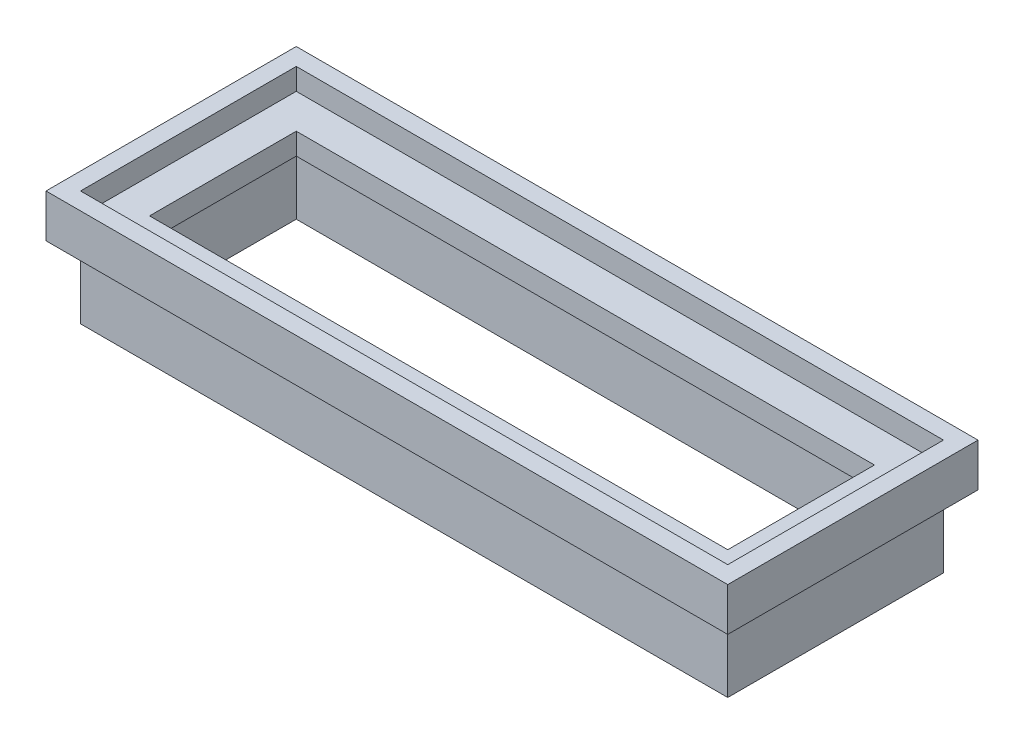
ISO-10303-21;
HEADER;
FILE_DESCRIPTION(('STEP AP214'),'2;1');
FILE_NAME('part.step','',(''),(''),'','','');
FILE_SCHEMA(('AUTOMOTIVE_DESIGN { 1 0 10303 214 1 1 1 1 }'));
ENDSEC;
DATA;
#1=APPLICATION_CONTEXT('core data for automotive mechanical design processes');
#2=APPLICATION_PROTOCOL_DEFINITION('international standard','automotive_design',2000,#1);
#3=PRODUCT_CONTEXT('',#1,'mechanical');
#4=PRODUCT('Part','Part','',(#3));
#5=PRODUCT_RELATED_PRODUCT_CATEGORY('part','',(#4));
#6=PRODUCT_DEFINITION_FORMATION('','',#4);
#7=PRODUCT_DEFINITION_CONTEXT('part definition',#1,'design');
#8=PRODUCT_DEFINITION('design','',#6,#7);
#9=PRODUCT_DEFINITION_SHAPE('','',#8);
#10=(LENGTH_UNIT() NAMED_UNIT(*) SI_UNIT(.MILLI.,.METRE.));
#11=(NAMED_UNIT(*) PLANE_ANGLE_UNIT() SI_UNIT($,.RADIAN.));
#12=(NAMED_UNIT(*) SI_UNIT($,.STERADIAN.) SOLID_ANGLE_UNIT());
#13=UNCERTAINTY_MEASURE_WITH_UNIT(LENGTH_MEASURE(1.E-05),#10,'distance_accuracy_value','');
#14=(GEOMETRIC_REPRESENTATION_CONTEXT(3) GLOBAL_UNCERTAINTY_ASSIGNED_CONTEXT((#13)) GLOBAL_UNIT_ASSIGNED_CONTEXT((#10,
#11,#12)) REPRESENTATION_CONTEXT('',''));
#15=CARTESIAN_POINT('',(0.,0.,0.));
#16=DIRECTION('',(0.,0.,1.));
#17=DIRECTION('',(1.,0.,0.));
#18=AXIS2_PLACEMENT_3D('',#15,#16,#17);
#19=CARTESIAN_POINT('',(0.,8.,0.));
#20=DIRECTION('',(0.,1.,0.));
#21=DIRECTION('',(0.,0.,1.));
#22=AXIS2_PLACEMENT_3D('',#19,#20,#21);
#23=PLANE('',#22);
#24=DIRECTION('',(0.,0.,1.));
#25=VECTOR('',#24,1.);
#26=CARTESIAN_POINT('',(-29.2763157894737,8.,-7.74736842105263));
#27=LINE('',#26,#25);
#28=CARTESIAN_POINT('',(-29.2763157894737,8.,-11.3473684210526));
#29=VERTEX_POINT('',#28);
#30=CARTESIAN_POINT('',(-29.2763157894737,8.,6.05263157894737));
#31=VERTEX_POINT('',#30);
#32=EDGE_CURVE('E271',#29,#31,#27,.T.);
#33=ORIENTED_EDGE('',*,*,#32,.T.);
#34=DIRECTION('',(1.,0.,0.));
#35=VECTOR('',#34,1.);
#36=CARTESIAN_POINT('',(-25.6763157894737,8.,6.05263157894737));
#37=LINE('',#36,#35);
#38=CARTESIAN_POINT('',(18.1236842105263,8.,6.05263157894737));
#39=VERTEX_POINT('',#38);
#40=EDGE_CURVE('E274',#31,#39,#37,.T.);
#41=ORIENTED_EDGE('',*,*,#40,.T.);
#42=DIRECTION('',(0.,0.,1.));
#43=VECTOR('',#42,1.);
#44=CARTESIAN_POINT('',(18.1236842105263,8.,-7.74736842105263));
#45=LINE('',#44,#43);
#46=CARTESIAN_POINT('',(18.1236842105263,8.,-11.3473684210526));
#47=VERTEX_POINT('',#46);
#48=EDGE_CURVE('E277',#47,#39,#45,.T.);
#49=ORIENTED_EDGE('',*,*,#48,.F.);
#50=DIRECTION('',(1.,0.,0.));
#51=VECTOR('',#50,1.);
#52=CARTESIAN_POINT('',(-25.6763157894737,8.,-11.3473684210526));
#53=LINE('',#52,#51);
#54=EDGE_CURVE('E280',#29,#47,#53,.T.);
#55=ORIENTED_EDGE('',*,*,#54,.F.);
#56=EDGE_LOOP('',(#33,#41,#49,#55));
#57=FACE_BOUND('',#56,.T.);
#58=DIRECTION('',(0.,0.,1.));
#59=VECTOR('',#58,1.);
#60=CARTESIAN_POINT('',(-28.0763157894737,8.,-10.1473684210526));
#61=LINE('',#60,#59);
#62=CARTESIAN_POINT('',(-28.0763157894737,8.,-10.1473684210526));
#63=VERTEX_POINT('',#62);
#64=CARTESIAN_POINT('',(-28.0763157894737,8.,4.85263157894737));
#65=VERTEX_POINT('',#64);
#66=EDGE_CURVE('E233',#63,#65,#61,.T.);
#67=ORIENTED_EDGE('',*,*,#66,.F.);
#68=DIRECTION('',(1.,0.,0.));
#69=VECTOR('',#68,1.);
#70=CARTESIAN_POINT('',(-28.0763157894737,8.,-10.1473684210526));
#71=LINE('',#70,#69);
#72=CARTESIAN_POINT('',(16.9236842105263,8.,-10.1473684210526));
#73=VERTEX_POINT('',#72);
#74=EDGE_CURVE('E96',#63,#73,#71,.T.);
#75=ORIENTED_EDGE('',*,*,#74,.T.);
#76=DIRECTION('',(0.,0.,1.));
#77=VECTOR('',#76,1.);
#78=CARTESIAN_POINT('',(16.9236842105263,8.,-10.1473684210526));
#79=LINE('',#78,#77);
#80=CARTESIAN_POINT('',(16.9236842105263,8.,4.85263157894737));
#81=VERTEX_POINT('',#80);
#82=EDGE_CURVE('E237',#73,#81,#79,.T.);
#83=ORIENTED_EDGE('',*,*,#82,.T.);
#84=DIRECTION('',(1.,0.,0.));
#85=VECTOR('',#84,1.);
#86=CARTESIAN_POINT('',(-28.0763157894737,8.,4.85263157894737));
#87=LINE('',#86,#85);
#88=EDGE_CURVE('E642',#65,#81,#87,.T.);
#89=ORIENTED_EDGE('',*,*,#88,.F.);
#90=EDGE_LOOP('',(#67,#75,#83,#89));
#91=FACE_BOUND('',#90,.T.);
#92=ADVANCED_FACE('F81',(#57,#91),#23,.T.);
#93=CARTESIAN_POINT('',(0.,0.,0.));
#94=DIRECTION('',(0.,1.,0.));
#95=DIRECTION('',(0.,0.,1.));
#96=AXIS2_PLACEMENT_3D('',#93,#94,#95);
#97=PLANE('',#96);
#98=DIRECTION('',(0.,0.,1.));
#99=VECTOR('',#98,1.);
#100=CARTESIAN_POINT('',(-28.0763157894737,0.,-8.94736842105263));
#101=LINE('',#100,#99);
#102=CARTESIAN_POINT('',(-28.0763157894737,0.,-10.1473684210526));
#103=VERTEX_POINT('',#102);
#104=CARTESIAN_POINT('',(-28.0763157894737,0.,4.85263157894737));
#105=VERTEX_POINT('',#104);
#106=EDGE_CURVE('E335',#103,#105,#101,.T.);
#107=ORIENTED_EDGE('',*,*,#106,.F.);
#108=DIRECTION('',(1.,0.,0.));
#109=VECTOR('',#108,1.);
#110=CARTESIAN_POINT('',(-26.8763157894737,0.,-10.1473684210526));
#111=LINE('',#110,#109);
#112=CARTESIAN_POINT('',(16.9236842105263,0.,-10.1473684210526));
#113=VERTEX_POINT('',#112);
#114=EDGE_CURVE('E339',#103,#113,#111,.T.);
#115=ORIENTED_EDGE('',*,*,#114,.T.);
#116=DIRECTION('',(0.,0.,1.));
#117=VECTOR('',#116,1.);
#118=CARTESIAN_POINT('',(16.9236842105263,0.,-8.94736842105263));
#119=LINE('',#118,#117);
#120=CARTESIAN_POINT('',(16.9236842105263,0.,4.85263157894737));
#121=VERTEX_POINT('',#120);
#122=EDGE_CURVE('E353',#113,#121,#119,.T.);
#123=ORIENTED_EDGE('',*,*,#122,.T.);
#124=DIRECTION('',(1.,0.,0.));
#125=VECTOR('',#124,1.);
#126=CARTESIAN_POINT('',(-26.8763157894737,0.,4.85263157894737));
#127=LINE('',#126,#125);
#128=EDGE_CURVE('E350',#105,#121,#127,.T.);
#129=ORIENTED_EDGE('',*,*,#128,.F.);
#130=EDGE_LOOP('',(#107,#115,#123,#129));
#131=FACE_BOUND('',#130,.T.);
#132=DIRECTION('',(0.,0.,1.));
#133=VECTOR('',#132,1.);
#134=CARTESIAN_POINT('',(-26.8763157894737,0.,-8.94736842105263));
#135=LINE('',#134,#133);
#136=CARTESIAN_POINT('',(-26.8763157894737,0.,-8.94736842105263));
#137=VERTEX_POINT('',#136);
#138=CARTESIAN_POINT('',(-26.8763157894737,0.,3.65263157894737));
#139=VERTEX_POINT('',#138);
#140=EDGE_CURVE('E302',#137,#139,#135,.T.);
#141=ORIENTED_EDGE('',*,*,#140,.T.);
#142=DIRECTION('',(1.,0.,0.));
#143=VECTOR('',#142,1.);
#144=CARTESIAN_POINT('',(-26.8763157894737,0.,3.65263157894737));
#145=LINE('',#144,#143);
#146=CARTESIAN_POINT('',(15.7236842105263,0.,3.65263157894737));
#147=VERTEX_POINT('',#146);
#148=EDGE_CURVE('E318',#139,#147,#145,.T.);
#149=ORIENTED_EDGE('',*,*,#148,.T.);
#150=DIRECTION('',(0.,0.,1.));
#151=VECTOR('',#150,1.);
#152=CARTESIAN_POINT('',(15.7236842105263,0.,-8.94736842105263));
#153=LINE('',#152,#151);
#154=CARTESIAN_POINT('',(15.7236842105263,0.,-8.94736842105263));
#155=VERTEX_POINT('',#154);
#156=EDGE_CURVE('E321',#155,#147,#153,.T.);
#157=ORIENTED_EDGE('',*,*,#156,.F.);
#158=DIRECTION('',(1.,0.,0.));
#159=VECTOR('',#158,1.);
#160=CARTESIAN_POINT('',(-26.8763157894737,0.,-8.94736842105263));
#161=LINE('',#160,#159);
#162=EDGE_CURVE('E306',#137,#155,#161,.T.);
#163=ORIENTED_EDGE('',*,*,#162,.F.);
#164=EDGE_LOOP('',(#141,#149,#157,#163));
#165=FACE_BOUND('',#164,.T.);
#166=ADVANCED_FACE('F374',(#131,#165),#97,.F.);
#167=CARTESIAN_POINT('',(-28.0763157894737,5.,-8.94736842105263));
#168=DIRECTION('',(1.,0.,0.));
#169=DIRECTION('',(0.,0.,-1.));
#170=AXIS2_PLACEMENT_3D('',#167,#168,#169);
#171=PLANE('',#170);
#172=ORIENTED_EDGE('',*,*,#106,.T.);
#173=DIRECTION('',(0.,-1.,0.));
#174=VECTOR('',#173,1.);
#175=CARTESIAN_POINT('',(-28.0763157894737,5.,4.85263157894737));
#176=LINE('',#175,#174);
#177=CARTESIAN_POINT('',(-28.0763157894737,5.,4.85263157894737));
#178=VERTEX_POINT('',#177);
#179=EDGE_CURVE('E89',#178,#105,#176,.T.);
#180=ORIENTED_EDGE('',*,*,#179,.F.);
#181=DIRECTION('',(0.,0.,1.));
#182=VECTOR('',#181,1.);
#183=CARTESIAN_POINT('',(-28.0763157894737,5.,-8.94736842105263));
#184=LINE('',#183,#182);
#185=CARTESIAN_POINT('',(-28.0763157894737,5.,-10.1473684210526));
#186=VERTEX_POINT('',#185);
#187=EDGE_CURVE('E336',#186,#178,#184,.T.);
#188=ORIENTED_EDGE('',*,*,#187,.F.);
#189=DIRECTION('',(0.,-1.,0.));
#190=VECTOR('',#189,1.);
#191=CARTESIAN_POINT('',(-28.0763157894737,5.,-10.1473684210526));
#192=LINE('',#191,#190);
#193=EDGE_CURVE('E347',#186,#103,#192,.T.);
#194=ORIENTED_EDGE('',*,*,#193,.T.);
#195=EDGE_LOOP('',(#172,#180,#188,#194));
#196=FACE_BOUND('',#195,.T.);
#197=ADVANCED_FACE('F83',(#196),#171,.F.);
#198=CARTESIAN_POINT('',(-26.8763157894737,5.,4.85263157894737));
#199=DIRECTION('',(0.,0.,-1.));
#200=DIRECTION('',(-1.,0.,0.));
#201=AXIS2_PLACEMENT_3D('',#198,#199,#200);
#202=PLANE('',#201);
#203=ORIENTED_EDGE('',*,*,#128,.T.);
#204=DIRECTION('',(0.,-1.,0.));
#205=VECTOR('',#204,1.);
#206=CARTESIAN_POINT('',(16.9236842105263,5.,4.85263157894737));
#207=LINE('',#206,#205);
#208=CARTESIAN_POINT('',(16.9236842105263,5.,4.85263157894737));
#209=VERTEX_POINT('',#208);
#210=EDGE_CURVE('E361',#209,#121,#207,.T.);
#211=ORIENTED_EDGE('',*,*,#210,.F.);
#212=DIRECTION('',(1.,0.,0.));
#213=VECTOR('',#212,1.);
#214=CARTESIAN_POINT('',(-26.8763157894737,5.,4.85263157894737));
#215=LINE('',#214,#213);
#216=EDGE_CURVE('E338',#178,#209,#215,.T.);
#217=ORIENTED_EDGE('',*,*,#216,.F.);
#218=ORIENTED_EDGE('',*,*,#179,.T.);
#219=EDGE_LOOP('',(#203,#211,#217,#218));
#220=FACE_BOUND('',#219,.T.);
#221=ADVANCED_FACE('F366',(#220),#202,.F.);
#222=CARTESIAN_POINT('',(16.9236842105263,5.,-8.94736842105263));
#223=DIRECTION('',(1.,0.,0.));
#224=DIRECTION('',(0.,0.,-1.));
#225=AXIS2_PLACEMENT_3D('',#222,#223,#224);
#226=PLANE('',#225);
#227=ORIENTED_EDGE('',*,*,#122,.F.);
#228=DIRECTION('',(0.,-1.,0.));
#229=VECTOR('',#228,1.);
#230=CARTESIAN_POINT('',(16.9236842105263,5.,-10.1473684210526));
#231=LINE('',#230,#229);
#232=CARTESIAN_POINT('',(16.9236842105263,5.,-10.1473684210526));
#233=VERTEX_POINT('',#232);
#234=EDGE_CURVE('E359',#233,#113,#231,.T.);
#235=ORIENTED_EDGE('',*,*,#234,.F.);
#236=DIRECTION('',(0.,0.,1.));
#237=VECTOR('',#236,1.);
#238=CARTESIAN_POINT('',(16.9236842105263,5.,-8.94736842105263));
#239=LINE('',#238,#237);
#240=EDGE_CURVE('E341',#233,#209,#239,.T.);
#241=ORIENTED_EDGE('',*,*,#240,.T.);
#242=ORIENTED_EDGE('',*,*,#210,.T.);
#243=EDGE_LOOP('',(#227,#235,#241,#242));
#244=FACE_BOUND('',#243,.T.);
#245=ADVANCED_FACE('F381',(#244),#226,.T.);
#246=CARTESIAN_POINT('',(-26.8763157894737,5.,-10.1473684210526));
#247=DIRECTION('',(0.,0.,-1.));
#248=DIRECTION('',(-1.,0.,0.));
#249=AXIS2_PLACEMENT_3D('',#246,#247,#248);
#250=PLANE('',#249);
#251=ORIENTED_EDGE('',*,*,#114,.F.);
#252=ORIENTED_EDGE('',*,*,#193,.F.);
#253=DIRECTION('',(1.,0.,0.));
#254=VECTOR('',#253,1.);
#255=CARTESIAN_POINT('',(-26.8763157894737,5.,-10.1473684210526));
#256=LINE('',#255,#254);
#257=EDGE_CURVE('E344',#186,#233,#256,.T.);
#258=ORIENTED_EDGE('',*,*,#257,.T.);
#259=ORIENTED_EDGE('',*,*,#234,.T.);
#260=EDGE_LOOP('',(#251,#252,#258,#259));
#261=FACE_BOUND('',#260,.T.);
#262=ADVANCED_FACE('F377',(#261),#250,.T.);
#263=CARTESIAN_POINT('',(-26.8763157894737,5.,-8.94736842105263));
#264=DIRECTION('',(1.,0.,0.));
#265=DIRECTION('',(0.,0.,-1.));
#266=AXIS2_PLACEMENT_3D('',#263,#264,#265);
#267=PLANE('',#266);
#268=ORIENTED_EDGE('',*,*,#140,.F.);
#269=DIRECTION('',(0.,-1.,0.));
#270=VECTOR('',#269,1.);
#271=CARTESIAN_POINT('',(-26.8763157894737,5.,-8.94736842105263));
#272=LINE('',#271,#270);
#273=CARTESIAN_POINT('',(-26.8763157894737,5.,-8.94736842105263));
#274=VERTEX_POINT('',#273);
#275=EDGE_CURVE('E315',#274,#137,#272,.T.);
#276=ORIENTED_EDGE('',*,*,#275,.F.);
#277=DIRECTION('',(0.,0.,1.));
#278=VECTOR('',#277,1.);
#279=CARTESIAN_POINT('',(-26.8763157894737,5.,-8.94736842105263));
#280=LINE('',#279,#278);
#281=CARTESIAN_POINT('',(-26.8763157894737,5.,3.65263157894737));
#282=VERTEX_POINT('',#281);
#283=EDGE_CURVE('E303',#274,#282,#280,.T.);
#284=ORIENTED_EDGE('',*,*,#283,.T.);
#285=DIRECTION('',(0.,-1.,0.));
#286=VECTOR('',#285,1.);
#287=CARTESIAN_POINT('',(-26.8763157894737,5.,3.65263157894737));
#288=LINE('',#287,#286);
#289=EDGE_CURVE('E332',#282,#139,#288,.T.);
#290=ORIENTED_EDGE('',*,*,#289,.T.);
#291=EDGE_LOOP('',(#268,#276,#284,#290));
#292=FACE_BOUND('',#291,.T.);
#293=ADVANCED_FACE('F535',(#292),#267,.T.);
#294=CARTESIAN_POINT('',(-26.8763157894737,5.,3.65263157894737));
#295=DIRECTION('',(0.,0.,-1.));
#296=DIRECTION('',(-1.,0.,0.));
#297=AXIS2_PLACEMENT_3D('',#294,#295,#296);
#298=PLANE('',#297);
#299=ORIENTED_EDGE('',*,*,#148,.F.);
#300=ORIENTED_EDGE('',*,*,#289,.F.);
#301=DIRECTION('',(1.,0.,0.));
#302=VECTOR('',#301,1.);
#303=CARTESIAN_POINT('',(-26.8763157894737,5.,3.65263157894737));
#304=LINE('',#303,#302);
#305=CARTESIAN_POINT('',(15.7236842105263,5.,3.65263157894737));
#306=VERTEX_POINT('',#305);
#307=EDGE_CURVE('E305',#282,#306,#304,.T.);
#308=ORIENTED_EDGE('',*,*,#307,.T.);
#309=DIRECTION('',(0.,-1.,0.));
#310=VECTOR('',#309,1.);
#311=CARTESIAN_POINT('',(15.7236842105263,5.,3.65263157894737));
#312=LINE('',#311,#310);
#313=EDGE_CURVE('E330',#306,#147,#312,.T.);
#314=ORIENTED_EDGE('',*,*,#313,.T.);
#315=EDGE_LOOP('',(#299,#300,#308,#314));
#316=FACE_BOUND('',#315,.T.);
#317=ADVANCED_FACE('F525',(#316),#298,.T.);
#318=CARTESIAN_POINT('',(15.7236842105263,5.,-8.94736842105263));
#319=DIRECTION('',(1.,0.,0.));
#320=DIRECTION('',(0.,0.,-1.));
#321=AXIS2_PLACEMENT_3D('',#318,#319,#320);
#322=PLANE('',#321);
#323=ORIENTED_EDGE('',*,*,#156,.T.);
#324=ORIENTED_EDGE('',*,*,#313,.F.);
#325=DIRECTION('',(0.,0.,1.));
#326=VECTOR('',#325,1.);
#327=CARTESIAN_POINT('',(15.7236842105263,5.,-8.94736842105263));
#328=LINE('',#327,#326);
#329=CARTESIAN_POINT('',(15.7236842105263,5.,-8.94736842105263));
#330=VERTEX_POINT('',#329);
#331=EDGE_CURVE('E309',#330,#306,#328,.T.);
#332=ORIENTED_EDGE('',*,*,#331,.F.);
#333=DIRECTION('',(0.,-1.,0.));
#334=VECTOR('',#333,1.);
#335=CARTESIAN_POINT('',(15.7236842105263,5.,-8.94736842105263));
#336=LINE('',#335,#334);
#337=EDGE_CURVE('E328',#330,#155,#336,.T.);
#338=ORIENTED_EDGE('',*,*,#337,.T.);
#339=EDGE_LOOP('',(#323,#324,#332,#338));
#340=FACE_BOUND('',#339,.T.);
#341=ADVANCED_FACE('F395',(#340),#322,.F.);
#342=CARTESIAN_POINT('',(-26.8763157894737,5.,-8.94736842105263));
#343=DIRECTION('',(0.,0.,-1.));
#344=DIRECTION('',(-1.,0.,0.));
#345=AXIS2_PLACEMENT_3D('',#342,#343,#344);
#346=PLANE('',#345);
#347=ORIENTED_EDGE('',*,*,#162,.T.);
#348=ORIENTED_EDGE('',*,*,#337,.F.);
#349=DIRECTION('',(1.,0.,0.));
#350=VECTOR('',#349,1.);
#351=CARTESIAN_POINT('',(-26.8763157894737,5.,-8.94736842105263));
#352=LINE('',#351,#350);
#353=EDGE_CURVE('E312',#274,#330,#352,.T.);
#354=ORIENTED_EDGE('',*,*,#353,.F.);
#355=ORIENTED_EDGE('',*,*,#275,.T.);
#356=EDGE_LOOP('',(#347,#348,#354,#355));
#357=FACE_BOUND('',#356,.T.);
#358=ADVANCED_FACE('F386',(#357),#346,.F.);
#359=CARTESIAN_POINT('',(0.,5.,0.));
#360=DIRECTION('',(0.,1.,0.));
#361=DIRECTION('',(0.,0.,1.));
#362=AXIS2_PLACEMENT_3D('',#359,#360,#361);
#363=PLANE('',#362);
#364=DIRECTION('',(0.,0.,1.));
#365=VECTOR('',#364,1.);
#366=CARTESIAN_POINT('',(-29.2763157894737,5.,-7.74736842105263));
#367=LINE('',#366,#365);
#368=CARTESIAN_POINT('',(-29.2763157894737,5.,-11.3473684210526));
#369=VERTEX_POINT('',#368);
#370=CARTESIAN_POINT('',(-29.2763157894737,5.,6.05263157894737));
#371=VERTEX_POINT('',#370);
#372=EDGE_CURVE('E270',#369,#371,#367,.T.);
#373=ORIENTED_EDGE('',*,*,#372,.F.);
#374=DIRECTION('',(1.,0.,0.));
#375=VECTOR('',#374,1.);
#376=CARTESIAN_POINT('',(-25.6763157894737,5.,-11.3473684210526));
#377=LINE('',#376,#375);
#378=CARTESIAN_POINT('',(18.1236842105263,5.,-11.3473684210526));
#379=VERTEX_POINT('',#378);
#380=EDGE_CURVE('E275',#369,#379,#377,.T.);
#381=ORIENTED_EDGE('',*,*,#380,.T.);
#382=DIRECTION('',(0.,0.,1.));
#383=VECTOR('',#382,1.);
#384=CARTESIAN_POINT('',(18.1236842105263,5.,-7.74736842105263));
#385=LINE('',#384,#383);
#386=CARTESIAN_POINT('',(18.1236842105263,5.,6.05263157894737));
#387=VERTEX_POINT('',#386);
#388=EDGE_CURVE('E289',#379,#387,#385,.T.);
#389=ORIENTED_EDGE('',*,*,#388,.T.);
#390=DIRECTION('',(1.,0.,0.));
#391=VECTOR('',#390,1.);
#392=CARTESIAN_POINT('',(-25.6763157894737,5.,6.05263157894737));
#393=LINE('',#392,#391);
#394=EDGE_CURVE('E286',#371,#387,#393,.T.);
#395=ORIENTED_EDGE('',*,*,#394,.F.);
#396=EDGE_LOOP('',(#373,#381,#389,#395));
#397=FACE_BOUND('',#396,.T.);
#398=ORIENTED_EDGE('',*,*,#257,.F.);
#399=ORIENTED_EDGE('',*,*,#187,.T.);
#400=ORIENTED_EDGE('',*,*,#216,.T.);
#401=ORIENTED_EDGE('',*,*,#240,.F.);
#402=EDGE_LOOP('',(#398,#399,#400,#401));
#403=FACE_BOUND('',#402,.T.);
#404=ADVANCED_FACE('F383',(#397,#403),#363,.F.);
#405=ORIENTED_EDGE('',*,*,#307,.F.);
#406=ORIENTED_EDGE('',*,*,#283,.F.);
#407=ORIENTED_EDGE('',*,*,#353,.T.);
#408=ORIENTED_EDGE('',*,*,#331,.T.);
#409=EDGE_LOOP('',(#405,#406,#407,#408));
#410=FACE_BOUND('',#409,.T.);
#411=DIRECTION('',(0.,0.,1.));
#412=VECTOR('',#411,1.);
#413=CARTESIAN_POINT('',(-25.6763157894737,5.,-7.74736842105263));
#414=LINE('',#413,#412);
#415=CARTESIAN_POINT('',(-25.6763157894737,5.,-7.74736842105263));
#416=VERTEX_POINT('',#415);
#417=CARTESIAN_POINT('',(-25.6763157894737,5.,2.45263157894737));
#418=VERTEX_POINT('',#417);
#419=EDGE_CURVE('E250',#416,#418,#414,.T.);
#420=ORIENTED_EDGE('',*,*,#419,.T.);
#421=DIRECTION('',(1.,0.,0.));
#422=VECTOR('',#421,1.);
#423=CARTESIAN_POINT('',(-25.6763157894737,5.,2.45263157894737));
#424=LINE('',#423,#422);
#425=CARTESIAN_POINT('',(14.5236842105263,5.,2.45263157894737));
#426=VERTEX_POINT('',#425);
#427=EDGE_CURVE('E253',#418,#426,#424,.T.);
#428=ORIENTED_EDGE('',*,*,#427,.T.);
#429=DIRECTION('',(0.,0.,1.));
#430=VECTOR('',#429,1.);
#431=CARTESIAN_POINT('',(14.5236842105263,5.,-7.74736842105263));
#432=LINE('',#431,#430);
#433=CARTESIAN_POINT('',(14.5236842105263,5.,-7.74736842105263));
#434=VERTEX_POINT('',#433);
#435=EDGE_CURVE('E256',#434,#426,#432,.T.);
#436=ORIENTED_EDGE('',*,*,#435,.F.);
#437=DIRECTION('',(1.,0.,0.));
#438=VECTOR('',#437,1.);
#439=CARTESIAN_POINT('',(-25.6763157894737,5.,-7.74736842105263));
#440=LINE('',#439,#438);
#441=EDGE_CURVE('E259',#416,#434,#440,.T.);
#442=ORIENTED_EDGE('',*,*,#441,.F.);
#443=EDGE_LOOP('',(#420,#428,#436,#442));
#444=FACE_BOUND('',#443,.T.);
#445=ADVANCED_FACE('F385',(#410,#444),#363,.F.);
#446=CARTESIAN_POINT('',(-29.2763157894737,8.,-7.74736842105263));
#447=DIRECTION('',(1.,0.,0.));
#448=DIRECTION('',(0.,0.,-1.));
#449=AXIS2_PLACEMENT_3D('',#446,#447,#448);
#450=PLANE('',#449);
#451=ORIENTED_EDGE('',*,*,#372,.T.);
#452=DIRECTION('',(0.,-1.,0.));
#453=VECTOR('',#452,1.);
#454=CARTESIAN_POINT('',(-29.2763157894737,8.,6.05263157894737));
#455=LINE('',#454,#453);
#456=EDGE_CURVE('E299',#31,#371,#455,.T.);
#457=ORIENTED_EDGE('',*,*,#456,.F.);
#458=ORIENTED_EDGE('',*,*,#32,.F.);
#459=DIRECTION('',(0.,-1.,0.));
#460=VECTOR('',#459,1.);
#461=CARTESIAN_POINT('',(-29.2763157894737,8.,-11.3473684210526));
#462=LINE('',#461,#460);
#463=EDGE_CURVE('E283',#29,#369,#462,.T.);
#464=ORIENTED_EDGE('',*,*,#463,.T.);
#465=EDGE_LOOP('',(#451,#457,#458,#464));
#466=FACE_BOUND('',#465,.T.);
#467=ADVANCED_FACE('F393',(#466),#450,.F.);
#468=CARTESIAN_POINT('',(-25.6763157894737,8.,6.05263157894737));
#469=DIRECTION('',(0.,0.,-1.));
#470=DIRECTION('',(-1.,0.,0.));
#471=AXIS2_PLACEMENT_3D('',#468,#469,#470);
#472=PLANE('',#471);
#473=ORIENTED_EDGE('',*,*,#394,.T.);
#474=DIRECTION('',(0.,-1.,0.));
#475=VECTOR('',#474,1.);
#476=CARTESIAN_POINT('',(18.1236842105263,8.,6.05263157894737));
#477=LINE('',#476,#475);
#478=EDGE_CURVE('E297',#39,#387,#477,.T.);
#479=ORIENTED_EDGE('',*,*,#478,.F.);
#480=ORIENTED_EDGE('',*,*,#40,.F.);
#481=ORIENTED_EDGE('',*,*,#456,.T.);
#482=EDGE_LOOP('',(#473,#479,#480,#481));
#483=FACE_BOUND('',#482,.T.);
#484=ADVANCED_FACE('F486',(#483),#472,.F.);
#485=CARTESIAN_POINT('',(18.1236842105263,8.,-7.74736842105263));
#486=DIRECTION('',(1.,0.,0.));
#487=DIRECTION('',(0.,0.,-1.));
#488=AXIS2_PLACEMENT_3D('',#485,#486,#487);
#489=PLANE('',#488);
#490=ORIENTED_EDGE('',*,*,#388,.F.);
#491=DIRECTION('',(0.,-1.,0.));
#492=VECTOR('',#491,1.);
#493=CARTESIAN_POINT('',(18.1236842105263,8.,-11.3473684210526));
#494=LINE('',#493,#492);
#495=EDGE_CURVE('E295',#47,#379,#494,.T.);
#496=ORIENTED_EDGE('',*,*,#495,.F.);
#497=ORIENTED_EDGE('',*,*,#48,.T.);
#498=ORIENTED_EDGE('',*,*,#478,.T.);
#499=EDGE_LOOP('',(#490,#496,#497,#498));
#500=FACE_BOUND('',#499,.T.);
#501=ADVANCED_FACE('F479',(#500),#489,.T.);
#502=CARTESIAN_POINT('',(-25.6763157894737,8.,-11.3473684210526));
#503=DIRECTION('',(0.,0.,-1.));
#504=DIRECTION('',(-1.,0.,0.));
#505=AXIS2_PLACEMENT_3D('',#502,#503,#504);
#506=PLANE('',#505);
#507=ORIENTED_EDGE('',*,*,#380,.F.);
#508=ORIENTED_EDGE('',*,*,#463,.F.);
#509=ORIENTED_EDGE('',*,*,#54,.T.);
#510=ORIENTED_EDGE('',*,*,#495,.T.);
#511=EDGE_LOOP('',(#507,#508,#509,#510));
#512=FACE_BOUND('',#511,.T.);
#513=ADVANCED_FACE('F413',(#512),#506,.T.);
#514=CARTESIAN_POINT('',(-25.6763157894737,8.,-7.74736842105263));
#515=DIRECTION('',(1.,0.,0.));
#516=DIRECTION('',(0.,0.,-1.));
#517=AXIS2_PLACEMENT_3D('',#514,#515,#516);
#518=PLANE('',#517);
#519=DIRECTION('',(0.,0.,-1.));
#520=VECTOR('',#519,1.);
#521=CARTESIAN_POINT('',(-25.6763157894737,6.5,-7.74736842105263));
#522=LINE('',#521,#520);
#523=CARTESIAN_POINT('',(-25.6763157894737,6.5,2.45263157894737));
#524=VERTEX_POINT('',#523);
#525=CARTESIAN_POINT('',(-25.6763157894737,6.5,-7.74736842105263));
#526=VERTEX_POINT('',#525);
#527=EDGE_CURVE('E104',#524,#526,#522,.T.);
#528=ORIENTED_EDGE('',*,*,#527,.F.);
#529=DIRECTION('',(0.,-1.,0.));
#530=VECTOR('',#529,1.);
#531=CARTESIAN_POINT('',(-25.6763157894737,8.,2.45263157894737));
#532=LINE('',#531,#530);
#533=EDGE_CURVE('E268',#524,#418,#532,.T.);
#534=ORIENTED_EDGE('',*,*,#533,.T.);
#535=ORIENTED_EDGE('',*,*,#419,.F.);
#536=DIRECTION('',(0.,-1.,0.));
#537=VECTOR('',#536,1.);
#538=CARTESIAN_POINT('',(-25.6763157894737,8.,-7.74736842105263));
#539=LINE('',#538,#537);
#540=EDGE_CURVE('E262',#526,#416,#539,.T.);
#541=ORIENTED_EDGE('',*,*,#540,.F.);
#542=EDGE_LOOP('',(#528,#534,#535,#541));
#543=FACE_BOUND('',#542,.T.);
#544=ADVANCED_FACE('F409',(#543),#518,.T.);
#545=CARTESIAN_POINT('',(-25.6763157894737,8.,2.45263157894737));
#546=DIRECTION('',(0.,0.,-1.));
#547=DIRECTION('',(-1.,0.,0.));
#548=AXIS2_PLACEMENT_3D('',#545,#546,#547);
#549=PLANE('',#548);
#550=DIRECTION('',(-1.,0.,0.));
#551=VECTOR('',#550,1.);
#552=CARTESIAN_POINT('',(-25.6763157894737,6.5,2.45263157894737));
#553=LINE('',#552,#551);
#554=CARTESIAN_POINT('',(14.5236842105263,6.5,2.45263157894737));
#555=VERTEX_POINT('',#554);
#556=EDGE_CURVE('E242',#555,#524,#553,.T.);
#557=ORIENTED_EDGE('',*,*,#556,.F.);
#558=DIRECTION('',(0.,-1.,0.));
#559=VECTOR('',#558,1.);
#560=CARTESIAN_POINT('',(14.5236842105263,8.,2.45263157894737));
#561=LINE('',#560,#559);
#562=EDGE_CURVE('E266',#555,#426,#561,.T.);
#563=ORIENTED_EDGE('',*,*,#562,.T.);
#564=ORIENTED_EDGE('',*,*,#427,.F.);
#565=ORIENTED_EDGE('',*,*,#533,.F.);
#566=EDGE_LOOP('',(#557,#563,#564,#565));
#567=FACE_BOUND('',#566,.T.);
#568=ADVANCED_FACE('F412',(#567),#549,.T.);
#569=CARTESIAN_POINT('',(14.5236842105263,8.,-7.74736842105263));
#570=DIRECTION('',(1.,0.,0.));
#571=DIRECTION('',(0.,0.,-1.));
#572=AXIS2_PLACEMENT_3D('',#569,#570,#571);
#573=PLANE('',#572);
#574=ORIENTED_EDGE('',*,*,#562,.F.);
#575=DIRECTION('',(0.,0.,-1.));
#576=VECTOR('',#575,1.);
#577=CARTESIAN_POINT('',(14.5236842105263,6.5,-7.74736842105263));
#578=LINE('',#577,#576);
#579=CARTESIAN_POINT('',(14.5236842105263,6.5,-7.74736842105263));
#580=VERTEX_POINT('',#579);
#581=EDGE_CURVE('E238',#555,#580,#578,.T.);
#582=ORIENTED_EDGE('',*,*,#581,.T.);
#583=DIRECTION('',(0.,-1.,0.));
#584=VECTOR('',#583,1.);
#585=CARTESIAN_POINT('',(14.5236842105263,8.,-7.74736842105263));
#586=LINE('',#585,#584);
#587=EDGE_CURVE('E264',#580,#434,#586,.T.);
#588=ORIENTED_EDGE('',*,*,#587,.T.);
#589=ORIENTED_EDGE('',*,*,#435,.T.);
#590=EDGE_LOOP('',(#574,#582,#588,#589));
#591=FACE_BOUND('',#590,.T.);
#592=ADVANCED_FACE('F417',(#591),#573,.F.);
#593=CARTESIAN_POINT('',(-25.6763157894737,8.,-7.74736842105263));
#594=DIRECTION('',(0.,0.,-1.));
#595=DIRECTION('',(-1.,0.,0.));
#596=AXIS2_PLACEMENT_3D('',#593,#594,#595);
#597=PLANE('',#596);
#598=ORIENTED_EDGE('',*,*,#587,.F.);
#599=DIRECTION('',(-1.,0.,0.));
#600=VECTOR('',#599,1.);
#601=CARTESIAN_POINT('',(-25.6763157894737,6.5,-7.74736842105263));
#602=LINE('',#601,#600);
#603=EDGE_CURVE('E12',#580,#526,#602,.T.);
#604=ORIENTED_EDGE('',*,*,#603,.T.);
#605=ORIENTED_EDGE('',*,*,#540,.T.);
#606=ORIENTED_EDGE('',*,*,#441,.T.);
#607=EDGE_LOOP('',(#598,#604,#605,#606));
#608=FACE_BOUND('',#607,.T.);
#609=ADVANCED_FACE('F421',(#608),#597,.F.);
#610=CARTESIAN_POINT('',(-28.0763157894737,6.5,-10.1473684210526));
#611=DIRECTION('',(0.,0.,1.));
#612=DIRECTION('',(1.,0.,0.));
#613=AXIS2_PLACEMENT_3D('',#610,#611,#612);
#614=PLANE('',#613);
#615=ORIENTED_EDGE('',*,*,#74,.F.);
#616=DIRECTION('',(0.,1.,0.));
#617=VECTOR('',#616,1.);
#618=CARTESIAN_POINT('',(-28.0763157894737,6.5,-10.1473684210526));
#619=LINE('',#618,#617);
#620=CARTESIAN_POINT('',(-28.0763157894737,6.5,-10.1473684210526));
#621=VERTEX_POINT('',#620);
#622=EDGE_CURVE('E232',#621,#63,#619,.T.);
#623=ORIENTED_EDGE('',*,*,#622,.F.);
#624=DIRECTION('',(1.,0.,0.));
#625=VECTOR('',#624,1.);
#626=CARTESIAN_POINT('',(-28.0763157894737,6.5,-10.1473684210526));
#627=LINE('',#626,#625);
#628=CARTESIAN_POINT('',(16.9236842105263,6.5,-10.1473684210526));
#629=VERTEX_POINT('',#628);
#630=EDGE_CURVE('E222',#621,#629,#627,.T.);
#631=ORIENTED_EDGE('',*,*,#630,.T.);
#632=DIRECTION('',(0.,1.,0.));
#633=VECTOR('',#632,1.);
#634=CARTESIAN_POINT('',(16.9236842105263,6.5,-10.1473684210526));
#635=LINE('',#634,#633);
#636=EDGE_CURVE('E231',#629,#73,#635,.T.);
#637=ORIENTED_EDGE('',*,*,#636,.T.);
#638=EDGE_LOOP('',(#615,#623,#631,#637));
#639=FACE_BOUND('',#638,.T.);
#640=ADVANCED_FACE('F230',(#639),#614,.T.);
#641=CARTESIAN_POINT('',(16.9236842105263,6.5,-10.1473684210526));
#642=DIRECTION('',(-1.,0.,0.));
#643=DIRECTION('',(0.,0.,1.));
#644=AXIS2_PLACEMENT_3D('',#641,#642,#643);
#645=PLANE('',#644);
#646=ORIENTED_EDGE('',*,*,#82,.F.);
#647=ORIENTED_EDGE('',*,*,#636,.F.);
#648=DIRECTION('',(0.,0.,1.));
#649=VECTOR('',#648,1.);
#650=CARTESIAN_POINT('',(16.9236842105263,6.5,-10.1473684210526));
#651=LINE('',#650,#649);
#652=CARTESIAN_POINT('',(16.9236842105263,6.5,4.85263157894737));
#653=VERTEX_POINT('',#652);
#654=EDGE_CURVE('E218',#629,#653,#651,.T.);
#655=ORIENTED_EDGE('',*,*,#654,.T.);
#656=DIRECTION('',(0.,1.,0.));
#657=VECTOR('',#656,1.);
#658=CARTESIAN_POINT('',(16.9236842105263,6.5,4.85263157894737));
#659=LINE('',#658,#657);
#660=EDGE_CURVE('E239',#653,#81,#659,.T.);
#661=ORIENTED_EDGE('',*,*,#660,.T.);
#662=EDGE_LOOP('',(#646,#647,#655,#661));
#663=FACE_BOUND('',#662,.T.);
#664=ADVANCED_FACE('F235',(#663),#645,.T.);
#665=CARTESIAN_POINT('',(-28.0763157894737,6.5,4.85263157894737));
#666=DIRECTION('',(0.,0.,1.));
#667=DIRECTION('',(1.,0.,0.));
#668=AXIS2_PLACEMENT_3D('',#665,#666,#667);
#669=PLANE('',#668);
#670=ORIENTED_EDGE('',*,*,#88,.T.);
#671=ORIENTED_EDGE('',*,*,#660,.F.);
#672=DIRECTION('',(1.,0.,0.));
#673=VECTOR('',#672,1.);
#674=CARTESIAN_POINT('',(-28.0763157894737,6.5,4.85263157894737));
#675=LINE('',#674,#673);
#676=CARTESIAN_POINT('',(-28.0763157894737,6.5,4.85263157894737));
#677=VERTEX_POINT('',#676);
#678=EDGE_CURVE('E225',#677,#653,#675,.T.);
#679=ORIENTED_EDGE('',*,*,#678,.F.);
#680=DIRECTION('',(0.,1.,0.));
#681=VECTOR('',#680,1.);
#682=CARTESIAN_POINT('',(-28.0763157894737,6.5,4.85263157894737));
#683=LINE('',#682,#681);
#684=EDGE_CURVE('E244',#677,#65,#683,.T.);
#685=ORIENTED_EDGE('',*,*,#684,.T.);
#686=EDGE_LOOP('',(#670,#671,#679,#685));
#687=FACE_BOUND('',#686,.T.);
#688=ADVANCED_FACE('F430',(#687),#669,.F.);
#689=CARTESIAN_POINT('',(-28.0763157894737,6.5,-10.1473684210526));
#690=DIRECTION('',(-1.,0.,0.));
#691=DIRECTION('',(0.,0.,1.));
#692=AXIS2_PLACEMENT_3D('',#689,#690,#691);
#693=PLANE('',#692);
#694=ORIENTED_EDGE('',*,*,#66,.T.);
#695=ORIENTED_EDGE('',*,*,#684,.F.);
#696=DIRECTION('',(0.,0.,1.));
#697=VECTOR('',#696,1.);
#698=CARTESIAN_POINT('',(-28.0763157894737,6.5,-10.1473684210526));
#699=LINE('',#698,#697);
#700=EDGE_CURVE('E649',#621,#677,#699,.T.);
#701=ORIENTED_EDGE('',*,*,#700,.F.);
#702=ORIENTED_EDGE('',*,*,#622,.T.);
#703=EDGE_LOOP('',(#694,#695,#701,#702));
#704=FACE_BOUND('',#703,.T.);
#705=ADVANCED_FACE('F433',(#704),#693,.F.);
#706=CARTESIAN_POINT('',(0.,6.5,0.));
#707=DIRECTION('',(0.,-1.,0.));
#708=DIRECTION('',(0.,0.,-1.));
#709=AXIS2_PLACEMENT_3D('',#706,#707,#708);
#710=PLANE('',#709);
#711=ORIENTED_EDGE('',*,*,#527,.T.);
#712=ORIENTED_EDGE('',*,*,#603,.F.);
#713=ORIENTED_EDGE('',*,*,#581,.F.);
#714=ORIENTED_EDGE('',*,*,#556,.T.);
#715=EDGE_LOOP('',(#711,#712,#713,#714));
#716=FACE_BOUND('',#715,.T.);
#717=ORIENTED_EDGE('',*,*,#630,.F.);
#718=ORIENTED_EDGE('',*,*,#700,.T.);
#719=ORIENTED_EDGE('',*,*,#678,.T.);
#720=ORIENTED_EDGE('',*,*,#654,.F.);
#721=EDGE_LOOP('',(#717,#718,#719,#720));
#722=FACE_BOUND('',#721,.T.);
#723=ADVANCED_FACE('F220',(#716,#722),#710,.F.);
#724=CLOSED_SHELL('',(#92,#166,#197,#221,#245,#262,#293,#317,#341,#358,#404,#445,#467,#484,#501,
#513,#544,#568,#592,#609,#640,#664,#688,#705,#723));
#725=MANIFOLD_SOLID_BREP('B2',#724);
#726=ADVANCED_BREP_SHAPE_REPRESENTATION('',(#18,#725),#14);
#727=SHAPE_DEFINITION_REPRESENTATION(#9,#726);
ENDSEC;
END-ISO-10303-21;
